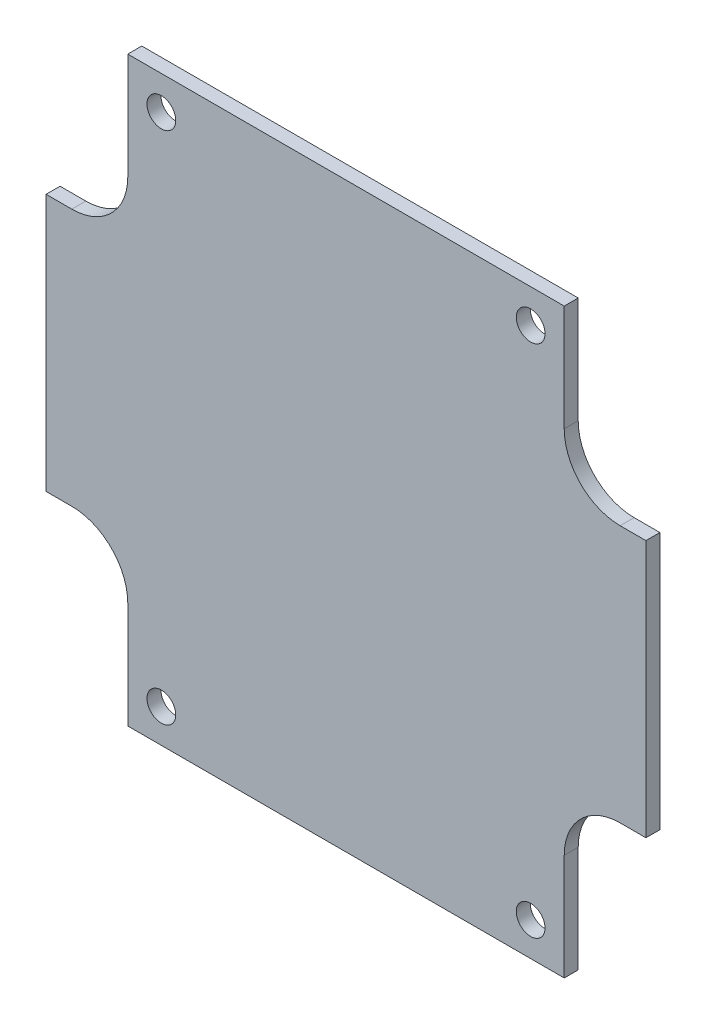
ISO-10303-21;
HEADER;
FILE_DESCRIPTION(('STEP AP214'),'2;1');
FILE_NAME('part.step','',(''),(''),'','','');
FILE_SCHEMA(('AUTOMOTIVE_DESIGN { 1 0 10303 214 1 1 1 1 }'));
ENDSEC;
DATA;
#1=APPLICATION_CONTEXT('core data for automotive mechanical design processes');
#2=APPLICATION_PROTOCOL_DEFINITION('international standard','automotive_design',2000,#1);
#3=PRODUCT_CONTEXT('',#1,'mechanical');
#4=PRODUCT('Part','Part','',(#3));
#5=PRODUCT_RELATED_PRODUCT_CATEGORY('part','',(#4));
#6=PRODUCT_DEFINITION_FORMATION('','',#4);
#7=PRODUCT_DEFINITION_CONTEXT('part definition',#1,'design');
#8=PRODUCT_DEFINITION('design','',#6,#7);
#9=PRODUCT_DEFINITION_SHAPE('','',#8);
#10=(LENGTH_UNIT() NAMED_UNIT(*) SI_UNIT(.MILLI.,.METRE.));
#11=(NAMED_UNIT(*) PLANE_ANGLE_UNIT() SI_UNIT($,.RADIAN.));
#12=(NAMED_UNIT(*) SI_UNIT($,.STERADIAN.) SOLID_ANGLE_UNIT());
#13=UNCERTAINTY_MEASURE_WITH_UNIT(LENGTH_MEASURE(1.E-05),#10,'distance_accuracy_value','');
#14=(GEOMETRIC_REPRESENTATION_CONTEXT(3) GLOBAL_UNCERTAINTY_ASSIGNED_CONTEXT((#13)) GLOBAL_UNIT_ASSIGNED_CONTEXT((#10,
#11,#12)) REPRESENTATION_CONTEXT('',''));
#15=CARTESIAN_POINT('',(0.,0.,0.));
#16=DIRECTION('',(0.,0.,1.));
#17=DIRECTION('',(1.,0.,0.));
#18=AXIS2_PLACEMENT_3D('',#15,#16,#17);
#19=CARTESIAN_POINT('',(0.,18.415,1.5875));
#20=DIRECTION('',(0.,1.,0.));
#21=DIRECTION('',(0.,0.,1.));
#22=AXIS2_PLACEMENT_3D('',#19,#20,#21);
#23=PLANE('',#22);
#24=DIRECTION('',(1.,0.,0.));
#25=VECTOR('',#24,1.);
#26=CARTESIAN_POINT('',(0.,18.415,0.));
#27=LINE('',#26,#25);
#28=CARTESIAN_POINT('',(0.,18.415,0.));
#29=VERTEX_POINT('',#28);
#30=CARTESIAN_POINT('',(2.92099999999996,18.415,0.));
#31=VERTEX_POINT('',#30);
#32=EDGE_CURVE('E176',#29,#31,#27,.T.);
#33=ORIENTED_EDGE('',*,*,#32,.T.);
#34=DIRECTION('',(0.,0.,-1.));
#35=VECTOR('',#34,1.);
#36=CARTESIAN_POINT('',(2.92099999999996,18.415,1.5875));
#37=LINE('',#36,#35);
#38=CARTESIAN_POINT('',(2.92099999999996,18.415,1.5875));
#39=VERTEX_POINT('',#38);
#40=EDGE_CURVE('E11',#39,#31,#37,.T.);
#41=ORIENTED_EDGE('',*,*,#40,.F.);
#42=DIRECTION('',(1.,0.,0.));
#43=VECTOR('',#42,1.);
#44=CARTESIAN_POINT('',(0.,18.415,1.5875));
#45=LINE('',#44,#43);
#46=CARTESIAN_POINT('',(0.,18.415,1.5875));
#47=VERTEX_POINT('',#46);
#48=EDGE_CURVE('E207',#47,#39,#45,.T.);
#49=ORIENTED_EDGE('',*,*,#48,.F.);
#50=DIRECTION('',(0.,0.,-1.));
#51=VECTOR('',#50,1.);
#52=CARTESIAN_POINT('',(0.,18.415,1.5875));
#53=LINE('',#52,#51);
#54=EDGE_CURVE('E172',#47,#29,#53,.T.);
#55=ORIENTED_EDGE('',*,*,#54,.T.);
#56=EDGE_LOOP('',(#33,#41,#49,#55));
#57=FACE_BOUND('',#56,.T.);
#58=ADVANCED_FACE('F32',(#57),#23,.F.);
#59=CARTESIAN_POINT('',(2.92100000000001,12.065,1.5875));
#60=DIRECTION('',(0.,0.,-1.));
#61=DIRECTION('',(-1.,0.,0.));
#62=AXIS2_PLACEMENT_3D('',#59,#60,#61);
#63=CYLINDRICAL_SURFACE('',#62,6.35);
#64=CARTESIAN_POINT('',(2.92100000000001,12.065,0.));
#65=DIRECTION('',(0.,0.,-1.));
#66=DIRECTION('',(-1.,0.,0.));
#67=AXIS2_PLACEMENT_3D('',#64,#65,#66);
#68=CIRCLE('',#67,6.35);
#69=CARTESIAN_POINT('',(9.27100000000001,12.065,0.));
#70=VERTEX_POINT('',#69);
#71=EDGE_CURVE('E179',#31,#70,#68,.T.);
#72=ORIENTED_EDGE('',*,*,#71,.T.);
#73=DIRECTION('',(0.,0.,-1.));
#74=VECTOR('',#73,1.);
#75=CARTESIAN_POINT('',(9.27100000000001,12.065,1.5875));
#76=LINE('',#75,#74);
#77=CARTESIAN_POINT('',(9.27100000000001,12.065,1.5875));
#78=VERTEX_POINT('',#77);
#79=EDGE_CURVE('E40',#78,#70,#76,.T.);
#80=ORIENTED_EDGE('',*,*,#79,.F.);
#81=CARTESIAN_POINT('',(2.92100000000001,12.065,1.5875));
#82=DIRECTION('',(0.,0.,-1.));
#83=DIRECTION('',(-1.,0.,0.));
#84=AXIS2_PLACEMENT_3D('',#81,#82,#83);
#85=CIRCLE('',#84,6.35);
#86=EDGE_CURVE('E115',#39,#78,#85,.T.);
#87=ORIENTED_EDGE('',*,*,#86,.F.);
#88=ORIENTED_EDGE('',*,*,#40,.T.);
#89=EDGE_LOOP('',(#72,#80,#87,#88));
#90=FACE_BOUND('',#89,.T.);
#91=ADVANCED_FACE('F307',(#90),#63,.F.);
#92=CARTESIAN_POINT('',(9.27100000000001,12.065,1.5875));
#93=DIRECTION('',(1.,0.,0.));
#94=DIRECTION('',(0.,1.,0.));
#95=AXIS2_PLACEMENT_3D('',#92,#93,#94);
#96=PLANE('',#95);
#97=DIRECTION('',(0.,-1.,0.));
#98=VECTOR('',#97,1.);
#99=CARTESIAN_POINT('',(9.27100000000001,12.065,0.));
#100=LINE('',#99,#98);
#101=CARTESIAN_POINT('',(9.27100000000001,0.,0.));
#102=VERTEX_POINT('',#101);
#103=EDGE_CURVE('E182',#70,#102,#100,.T.);
#104=ORIENTED_EDGE('',*,*,#103,.T.);
#105=DIRECTION('',(0.,0.,-1.));
#106=VECTOR('',#105,1.);
#107=CARTESIAN_POINT('',(9.27100000000001,0.,1.5875));
#108=LINE('',#107,#106);
#109=CARTESIAN_POINT('',(9.27100000000001,0.,1.5875));
#110=VERTEX_POINT('',#109);
#111=EDGE_CURVE('E238',#110,#102,#108,.T.);
#112=ORIENTED_EDGE('',*,*,#111,.F.);
#113=DIRECTION('',(0.,-1.,0.));
#114=VECTOR('',#113,1.);
#115=CARTESIAN_POINT('',(9.27100000000001,12.065,1.5875));
#116=LINE('',#115,#114);
#117=EDGE_CURVE('E246',#78,#110,#116,.T.);
#118=ORIENTED_EDGE('',*,*,#117,.F.);
#119=ORIENTED_EDGE('',*,*,#79,.T.);
#120=EDGE_LOOP('',(#104,#112,#118,#119));
#121=FACE_BOUND('',#120,.T.);
#122=ADVANCED_FACE('F244',(#121),#96,.F.);
#123=CARTESIAN_POINT('',(9.27100000000001,0.,1.5875));
#124=DIRECTION('',(0.,1.,0.));
#125=DIRECTION('',(-1.,0.,0.));
#126=AXIS2_PLACEMENT_3D('',#123,#124,#125);
#127=PLANE('',#126);
#128=DIRECTION('',(1.,0.,0.));
#129=VECTOR('',#128,1.);
#130=CARTESIAN_POINT('',(9.27100000000001,0.,0.));
#131=LINE('',#130,#129);
#132=CARTESIAN_POINT('',(58.801,0.,0.));
#133=VERTEX_POINT('',#132);
#134=EDGE_CURVE('E184',#102,#133,#131,.T.);
#135=ORIENTED_EDGE('',*,*,#134,.T.);
#136=DIRECTION('',(0.,0.,-1.));
#137=VECTOR('',#136,1.);
#138=CARTESIAN_POINT('',(58.801,0.,1.5875));
#139=LINE('',#138,#137);
#140=CARTESIAN_POINT('',(58.801,0.,1.5875));
#141=VERTEX_POINT('',#140);
#142=EDGE_CURVE('E235',#141,#133,#139,.T.);
#143=ORIENTED_EDGE('',*,*,#142,.F.);
#144=DIRECTION('',(1.,0.,0.));
#145=VECTOR('',#144,1.);
#146=CARTESIAN_POINT('',(9.27100000000001,0.,1.5875));
#147=LINE('',#146,#145);
#148=EDGE_CURVE('E264',#110,#141,#147,.T.);
#149=ORIENTED_EDGE('',*,*,#148,.F.);
#150=ORIENTED_EDGE('',*,*,#111,.T.);
#151=EDGE_LOOP('',(#135,#143,#149,#150));
#152=FACE_BOUND('',#151,.T.);
#153=ADVANCED_FACE('F255',(#152),#127,.F.);
#154=CARTESIAN_POINT('',(58.801,12.065,1.5875));
#155=DIRECTION('',(-1.,0.,0.));
#156=DIRECTION('',(0.,0.,1.));
#157=AXIS2_PLACEMENT_3D('',#154,#155,#156);
#158=PLANE('',#157);
#159=DIRECTION('',(0.,1.,0.));
#160=VECTOR('',#159,1.);
#161=CARTESIAN_POINT('',(58.801,12.065,0.));
#162=LINE('',#161,#160);
#163=CARTESIAN_POINT('',(58.801,12.065,0.));
#164=VERTEX_POINT('',#163);
#165=EDGE_CURVE('E186',#133,#164,#162,.T.);
#166=ORIENTED_EDGE('',*,*,#165,.T.);
#167=DIRECTION('',(0.,0.,-1.));
#168=VECTOR('',#167,1.);
#169=CARTESIAN_POINT('',(58.801,12.065,1.5875));
#170=LINE('',#169,#168);
#171=CARTESIAN_POINT('',(58.801,12.065,1.5875));
#172=VERTEX_POINT('',#171);
#173=EDGE_CURVE('E232',#172,#164,#170,.T.);
#174=ORIENTED_EDGE('',*,*,#173,.F.);
#175=DIRECTION('',(0.,1.,0.));
#176=VECTOR('',#175,1.);
#177=CARTESIAN_POINT('',(58.801,12.065,1.5875));
#178=LINE('',#177,#176);
#179=EDGE_CURVE('E261',#141,#172,#178,.T.);
#180=ORIENTED_EDGE('',*,*,#179,.F.);
#181=ORIENTED_EDGE('',*,*,#142,.T.);
#182=EDGE_LOOP('',(#166,#174,#180,#181));
#183=FACE_BOUND('',#182,.T.);
#184=ADVANCED_FACE('F259',(#183),#158,.F.);
#185=CARTESIAN_POINT('',(65.151,12.065,1.5875));
#186=DIRECTION('',(0.,0.,-1.));
#187=DIRECTION('',(-1.,0.,0.));
#188=AXIS2_PLACEMENT_3D('',#185,#186,#187);
#189=CYLINDRICAL_SURFACE('',#188,6.35);
#190=CARTESIAN_POINT('',(65.151,12.065,0.));
#191=DIRECTION('',(0.,0.,-1.));
#192=DIRECTION('',(1.,0.,0.));
#193=AXIS2_PLACEMENT_3D('',#190,#191,#192);
#194=CIRCLE('',#193,6.35);
#195=CARTESIAN_POINT('',(65.151,18.415,0.));
#196=VERTEX_POINT('',#195);
#197=EDGE_CURVE('E188',#164,#196,#194,.T.);
#198=ORIENTED_EDGE('',*,*,#197,.T.);
#199=DIRECTION('',(0.,0.,-1.));
#200=VECTOR('',#199,1.);
#201=CARTESIAN_POINT('',(65.151,18.415,1.5875));
#202=LINE('',#201,#200);
#203=CARTESIAN_POINT('',(65.151,18.415,1.5875));
#204=VERTEX_POINT('',#203);
#205=EDGE_CURVE('E229',#204,#196,#202,.T.);
#206=ORIENTED_EDGE('',*,*,#205,.F.);
#207=CARTESIAN_POINT('',(65.151,12.065,1.5875));
#208=DIRECTION('',(0.,0.,-1.));
#209=DIRECTION('',(1.,0.,0.));
#210=AXIS2_PLACEMENT_3D('',#207,#208,#209);
#211=CIRCLE('',#210,6.35);
#212=EDGE_CURVE('E263',#172,#204,#211,.T.);
#213=ORIENTED_EDGE('',*,*,#212,.F.);
#214=ORIENTED_EDGE('',*,*,#173,.T.);
#215=EDGE_LOOP('',(#198,#206,#213,#214));
#216=FACE_BOUND('',#215,.T.);
#217=ADVANCED_FACE('F320',(#216),#189,.F.);
#218=CARTESIAN_POINT('',(68.072,18.415,1.5875));
#219=DIRECTION('',(0.,1.,0.));
#220=DIRECTION('',(0.,0.,1.));
#221=AXIS2_PLACEMENT_3D('',#218,#219,#220);
#222=PLANE('',#221);
#223=DIRECTION('',(1.,0.,0.));
#224=VECTOR('',#223,1.);
#225=CARTESIAN_POINT('',(68.072,18.415,0.));
#226=LINE('',#225,#224);
#227=CARTESIAN_POINT('',(68.072,18.415,0.));
#228=VERTEX_POINT('',#227);
#229=EDGE_CURVE('E190',#196,#228,#226,.T.);
#230=ORIENTED_EDGE('',*,*,#229,.T.);
#231=DIRECTION('',(0.,0.,-1.));
#232=VECTOR('',#231,1.);
#233=CARTESIAN_POINT('',(68.072,18.415,1.5875));
#234=LINE('',#233,#232);
#235=CARTESIAN_POINT('',(68.072,18.415,1.5875));
#236=VERTEX_POINT('',#235);
#237=EDGE_CURVE('E226',#236,#228,#234,.T.);
#238=ORIENTED_EDGE('',*,*,#237,.F.);
#239=DIRECTION('',(1.,0.,0.));
#240=VECTOR('',#239,1.);
#241=CARTESIAN_POINT('',(68.072,18.415,1.5875));
#242=LINE('',#241,#240);
#243=EDGE_CURVE('E266',#204,#236,#242,.T.);
#244=ORIENTED_EDGE('',*,*,#243,.F.);
#245=ORIENTED_EDGE('',*,*,#205,.T.);
#246=EDGE_LOOP('',(#230,#238,#244,#245));
#247=FACE_BOUND('',#246,.T.);
#248=ADVANCED_FACE('F323',(#247),#222,.F.);
#249=CARTESIAN_POINT('',(68.072,47.625,1.5875));
#250=DIRECTION('',(-1.,0.,0.));
#251=DIRECTION('',(0.,0.,1.));
#252=AXIS2_PLACEMENT_3D('',#249,#250,#251);
#253=PLANE('',#252);
#254=DIRECTION('',(0.,1.,0.));
#255=VECTOR('',#254,1.);
#256=CARTESIAN_POINT('',(68.072,47.625,0.));
#257=LINE('',#256,#255);
#258=CARTESIAN_POINT('',(68.072,47.625,0.));
#259=VERTEX_POINT('',#258);
#260=EDGE_CURVE('E192',#228,#259,#257,.T.);
#261=ORIENTED_EDGE('',*,*,#260,.T.);
#262=DIRECTION('',(0.,0.,-1.));
#263=VECTOR('',#262,1.);
#264=CARTESIAN_POINT('',(68.072,47.625,1.5875));
#265=LINE('',#264,#263);
#266=CARTESIAN_POINT('',(68.072,47.625,1.5875));
#267=VERTEX_POINT('',#266);
#268=EDGE_CURVE('E223',#267,#259,#265,.T.);
#269=ORIENTED_EDGE('',*,*,#268,.F.);
#270=DIRECTION('',(0.,1.,0.));
#271=VECTOR('',#270,1.);
#272=CARTESIAN_POINT('',(68.072,47.625,1.5875));
#273=LINE('',#272,#271);
#274=EDGE_CURVE('E272',#236,#267,#273,.T.);
#275=ORIENTED_EDGE('',*,*,#274,.F.);
#276=ORIENTED_EDGE('',*,*,#237,.T.);
#277=EDGE_LOOP('',(#261,#269,#275,#276));
#278=FACE_BOUND('',#277,.T.);
#279=ADVANCED_FACE('F327',(#278),#253,.F.);
#280=CARTESIAN_POINT('',(68.072,47.625,1.5875));
#281=DIRECTION('',(0.,-1.,0.));
#282=DIRECTION('',(0.,0.,-1.));
#283=AXIS2_PLACEMENT_3D('',#280,#281,#282);
#284=PLANE('',#283);
#285=DIRECTION('',(-1.,0.,0.));
#286=VECTOR('',#285,1.);
#287=CARTESIAN_POINT('',(68.072,47.625,0.));
#288=LINE('',#287,#286);
#289=CARTESIAN_POINT('',(65.151,47.625,0.));
#290=VERTEX_POINT('',#289);
#291=EDGE_CURVE('E194',#259,#290,#288,.T.);
#292=ORIENTED_EDGE('',*,*,#291,.T.);
#293=DIRECTION('',(0.,0.,-1.));
#294=VECTOR('',#293,1.);
#295=CARTESIAN_POINT('',(65.151,47.625,1.5875));
#296=LINE('',#295,#294);
#297=CARTESIAN_POINT('',(65.151,47.625,1.5875));
#298=VERTEX_POINT('',#297);
#299=EDGE_CURVE('E220',#298,#290,#296,.T.);
#300=ORIENTED_EDGE('',*,*,#299,.F.);
#301=DIRECTION('',(-1.,0.,0.));
#302=VECTOR('',#301,1.);
#303=CARTESIAN_POINT('',(68.072,47.625,1.5875));
#304=LINE('',#303,#302);
#305=EDGE_CURVE('E274',#267,#298,#304,.T.);
#306=ORIENTED_EDGE('',*,*,#305,.F.);
#307=ORIENTED_EDGE('',*,*,#268,.T.);
#308=EDGE_LOOP('',(#292,#300,#306,#307));
#309=FACE_BOUND('',#308,.T.);
#310=ADVANCED_FACE('F331',(#309),#284,.F.);
#311=CARTESIAN_POINT('',(65.151,53.975,1.5875));
#312=DIRECTION('',(0.,0.,-1.));
#313=DIRECTION('',(-1.,0.,0.));
#314=AXIS2_PLACEMENT_3D('',#311,#312,#313);
#315=CYLINDRICAL_SURFACE('',#314,6.35);
#316=CARTESIAN_POINT('',(65.151,53.975,0.));
#317=DIRECTION('',(0.,0.,-1.));
#318=DIRECTION('',(1.,0.,0.));
#319=AXIS2_PLACEMENT_3D('',#316,#317,#318);
#320=CIRCLE('',#319,6.35);
#321=CARTESIAN_POINT('',(58.801,53.975,0.));
#322=VERTEX_POINT('',#321);
#323=EDGE_CURVE('E196',#290,#322,#320,.T.);
#324=ORIENTED_EDGE('',*,*,#323,.T.);
#325=DIRECTION('',(0.,0.,-1.));
#326=VECTOR('',#325,1.);
#327=CARTESIAN_POINT('',(58.801,53.975,1.5875));
#328=LINE('',#327,#326);
#329=CARTESIAN_POINT('',(58.801,53.975,1.5875));
#330=VERTEX_POINT('',#329);
#331=EDGE_CURVE('E217',#330,#322,#328,.T.);
#332=ORIENTED_EDGE('',*,*,#331,.F.);
#333=CARTESIAN_POINT('',(65.151,53.975,1.5875));
#334=DIRECTION('',(0.,0.,-1.));
#335=DIRECTION('',(1.,0.,0.));
#336=AXIS2_PLACEMENT_3D('',#333,#334,#335);
#337=CIRCLE('',#336,6.35);
#338=EDGE_CURVE('E276',#298,#330,#337,.T.);
#339=ORIENTED_EDGE('',*,*,#338,.F.);
#340=ORIENTED_EDGE('',*,*,#299,.T.);
#341=EDGE_LOOP('',(#324,#332,#339,#340));
#342=FACE_BOUND('',#341,.T.);
#343=ADVANCED_FACE('F335',(#342),#315,.F.);
#344=CARTESIAN_POINT('',(58.801,53.975,1.5875));
#345=DIRECTION('',(-1.,0.,0.));
#346=DIRECTION('',(0.,0.,1.));
#347=AXIS2_PLACEMENT_3D('',#344,#345,#346);
#348=PLANE('',#347);
#349=DIRECTION('',(0.,1.,0.));
#350=VECTOR('',#349,1.);
#351=CARTESIAN_POINT('',(58.801,53.975,0.));
#352=LINE('',#351,#350);
#353=CARTESIAN_POINT('',(58.801,66.04,0.));
#354=VERTEX_POINT('',#353);
#355=EDGE_CURVE('E198',#322,#354,#352,.T.);
#356=ORIENTED_EDGE('',*,*,#355,.T.);
#357=DIRECTION('',(0.,0.,-1.));
#358=VECTOR('',#357,1.);
#359=CARTESIAN_POINT('',(58.801,66.04,1.5875));
#360=LINE('',#359,#358);
#361=CARTESIAN_POINT('',(58.801,66.04,1.5875));
#362=VERTEX_POINT('',#361);
#363=EDGE_CURVE('E214',#362,#354,#360,.T.);
#364=ORIENTED_EDGE('',*,*,#363,.F.);
#365=DIRECTION('',(0.,1.,0.));
#366=VECTOR('',#365,1.);
#367=CARTESIAN_POINT('',(58.801,53.975,1.5875));
#368=LINE('',#367,#366);
#369=EDGE_CURVE('E278',#330,#362,#368,.T.);
#370=ORIENTED_EDGE('',*,*,#369,.F.);
#371=ORIENTED_EDGE('',*,*,#331,.T.);
#372=EDGE_LOOP('',(#356,#364,#370,#371));
#373=FACE_BOUND('',#372,.T.);
#374=ADVANCED_FACE('F339',(#373),#348,.F.);
#375=CARTESIAN_POINT('',(9.27099999999999,66.04,1.5875));
#376=DIRECTION('',(0.,-1.,0.));
#377=DIRECTION('',(0.,0.,-1.));
#378=AXIS2_PLACEMENT_3D('',#375,#376,#377);
#379=PLANE('',#378);
#380=DIRECTION('',(-1.,0.,0.));
#381=VECTOR('',#380,1.);
#382=CARTESIAN_POINT('',(9.27099999999999,66.04,0.));
#383=LINE('',#382,#381);
#384=CARTESIAN_POINT('',(9.27099999999999,66.04,0.));
#385=VERTEX_POINT('',#384);
#386=EDGE_CURVE('E200',#354,#385,#383,.T.);
#387=ORIENTED_EDGE('',*,*,#386,.T.);
#388=DIRECTION('',(0.,0.,-1.));
#389=VECTOR('',#388,1.);
#390=CARTESIAN_POINT('',(9.27099999999999,66.04,1.5875));
#391=LINE('',#390,#389);
#392=CARTESIAN_POINT('',(9.27099999999999,66.04,1.5875));
#393=VERTEX_POINT('',#392);
#394=EDGE_CURVE('E211',#393,#385,#391,.T.);
#395=ORIENTED_EDGE('',*,*,#394,.F.);
#396=DIRECTION('',(-1.,0.,0.));
#397=VECTOR('',#396,1.);
#398=CARTESIAN_POINT('',(9.27099999999999,66.04,1.5875));
#399=LINE('',#398,#397);
#400=EDGE_CURVE('E280',#362,#393,#399,.T.);
#401=ORIENTED_EDGE('',*,*,#400,.F.);
#402=ORIENTED_EDGE('',*,*,#363,.T.);
#403=EDGE_LOOP('',(#387,#395,#401,#402));
#404=FACE_BOUND('',#403,.T.);
#405=ADVANCED_FACE('F286',(#404),#379,.F.);
#406=CARTESIAN_POINT('',(9.27099999999999,53.975,1.5875));
#407=DIRECTION('',(1.,0.,0.));
#408=DIRECTION('',(0.,0.,-1.));
#409=AXIS2_PLACEMENT_3D('',#406,#407,#408);
#410=PLANE('',#409);
#411=DIRECTION('',(0.,-1.,0.));
#412=VECTOR('',#411,1.);
#413=CARTESIAN_POINT('',(9.27099999999999,53.975,0.));
#414=LINE('',#413,#412);
#415=CARTESIAN_POINT('',(9.27099999999999,53.975,0.));
#416=VERTEX_POINT('',#415);
#417=EDGE_CURVE('E202',#385,#416,#414,.T.);
#418=ORIENTED_EDGE('',*,*,#417,.T.);
#419=DIRECTION('',(0.,0.,-1.));
#420=VECTOR('',#419,1.);
#421=CARTESIAN_POINT('',(9.27099999999999,53.975,1.5875));
#422=LINE('',#421,#420);
#423=CARTESIAN_POINT('',(9.27099999999999,53.975,1.5875));
#424=VERTEX_POINT('',#423);
#425=EDGE_CURVE('E167',#424,#416,#422,.T.);
#426=ORIENTED_EDGE('',*,*,#425,.F.);
#427=DIRECTION('',(0.,-1.,0.));
#428=VECTOR('',#427,1.);
#429=CARTESIAN_POINT('',(9.27099999999999,53.975,1.5875));
#430=LINE('',#429,#428);
#431=EDGE_CURVE('E158',#393,#424,#430,.T.);
#432=ORIENTED_EDGE('',*,*,#431,.F.);
#433=ORIENTED_EDGE('',*,*,#394,.T.);
#434=EDGE_LOOP('',(#418,#426,#432,#433));
#435=FACE_BOUND('',#434,.T.);
#436=ADVANCED_FACE('F290',(#435),#410,.F.);
#437=CARTESIAN_POINT('',(2.92099999999999,53.975,1.5875));
#438=DIRECTION('',(0.,0.,-1.));
#439=DIRECTION('',(-1.,0.,0.));
#440=AXIS2_PLACEMENT_3D('',#437,#438,#439);
#441=CYLINDRICAL_SURFACE('',#440,6.35);
#442=CARTESIAN_POINT('',(2.92099999999999,53.975,0.));
#443=DIRECTION('',(0.,0.,-1.));
#444=DIRECTION('',(-1.,0.,0.));
#445=AXIS2_PLACEMENT_3D('',#442,#443,#444);
#446=CIRCLE('',#445,6.35);
#447=CARTESIAN_POINT('',(2.92099999999995,47.625,0.));
#448=VERTEX_POINT('',#447);
#449=EDGE_CURVE('E166',#416,#448,#446,.T.);
#450=ORIENTED_EDGE('',*,*,#449,.T.);
#451=DIRECTION('',(0.,0.,-1.));
#452=VECTOR('',#451,1.);
#453=CARTESIAN_POINT('',(2.92099999999995,47.625,1.5875));
#454=LINE('',#453,#452);
#455=CARTESIAN_POINT('',(2.92099999999995,47.625,1.5875));
#456=VERTEX_POINT('',#455);
#457=EDGE_CURVE('E163',#456,#448,#454,.T.);
#458=ORIENTED_EDGE('',*,*,#457,.F.);
#459=CARTESIAN_POINT('',(2.92099999999999,53.975,1.5875));
#460=DIRECTION('',(0.,0.,-1.));
#461=DIRECTION('',(-1.,0.,0.));
#462=AXIS2_PLACEMENT_3D('',#459,#460,#461);
#463=CIRCLE('',#462,6.35);
#464=EDGE_CURVE('E152',#424,#456,#463,.T.);
#465=ORIENTED_EDGE('',*,*,#464,.F.);
#466=ORIENTED_EDGE('',*,*,#425,.T.);
#467=EDGE_LOOP('',(#450,#458,#465,#466));
#468=FACE_BOUND('',#467,.T.);
#469=ADVANCED_FACE('F164',(#468),#441,.F.);
#470=CARTESIAN_POINT('',(0.,47.625,1.5875));
#471=DIRECTION('',(0.,-1.,0.));
#472=DIRECTION('',(0.,0.,-1.));
#473=AXIS2_PLACEMENT_3D('',#470,#471,#472);
#474=PLANE('',#473);
#475=DIRECTION('',(-1.,0.,0.));
#476=VECTOR('',#475,1.);
#477=CARTESIAN_POINT('',(0.,47.625,0.));
#478=LINE('',#477,#476);
#479=CARTESIAN_POINT('',(0.,47.625,0.));
#480=VERTEX_POINT('',#479);
#481=EDGE_CURVE('E101',#448,#480,#478,.T.);
#482=ORIENTED_EDGE('',*,*,#481,.T.);
#483=DIRECTION('',(0.,0.,-1.));
#484=VECTOR('',#483,1.);
#485=CARTESIAN_POINT('',(0.,47.625,1.5875));
#486=LINE('',#485,#484);
#487=CARTESIAN_POINT('',(0.,47.625,1.5875));
#488=VERTEX_POINT('',#487);
#489=EDGE_CURVE('E168',#488,#480,#486,.T.);
#490=ORIENTED_EDGE('',*,*,#489,.F.);
#491=DIRECTION('',(-1.,0.,0.));
#492=VECTOR('',#491,1.);
#493=CARTESIAN_POINT('',(0.,47.625,1.5875));
#494=LINE('',#493,#492);
#495=EDGE_CURVE('E156',#456,#488,#494,.T.);
#496=ORIENTED_EDGE('',*,*,#495,.F.);
#497=ORIENTED_EDGE('',*,*,#457,.T.);
#498=EDGE_LOOP('',(#482,#490,#496,#497));
#499=FACE_BOUND('',#498,.T.);
#500=ADVANCED_FACE('F170',(#499),#474,.F.);
#501=CARTESIAN_POINT('',(0.,47.625,1.5875));
#502=DIRECTION('',(1.,0.,0.));
#503=DIRECTION('',(0.,1.,0.));
#504=AXIS2_PLACEMENT_3D('',#501,#502,#503);
#505=PLANE('',#504);
#506=DIRECTION('',(0.,-1.,0.));
#507=VECTOR('',#506,1.);
#508=CARTESIAN_POINT('',(0.,47.625,0.));
#509=LINE('',#508,#507);
#510=EDGE_CURVE('E107',#480,#29,#509,.T.);
#511=ORIENTED_EDGE('',*,*,#510,.T.);
#512=ORIENTED_EDGE('',*,*,#54,.F.);
#513=DIRECTION('',(0.,-1.,0.));
#514=VECTOR('',#513,1.);
#515=CARTESIAN_POINT('',(0.,47.625,1.5875));
#516=LINE('',#515,#514);
#517=EDGE_CURVE('E48',#488,#47,#516,.T.);
#518=ORIENTED_EDGE('',*,*,#517,.F.);
#519=ORIENTED_EDGE('',*,*,#489,.T.);
#520=EDGE_LOOP('',(#511,#512,#518,#519));
#521=FACE_BOUND('',#520,.T.);
#522=ADVANCED_FACE('F294',(#521),#505,.F.);
#523=CARTESIAN_POINT('',(2.92100000000001,12.065,1.5875));
#524=DIRECTION('',(0.,0.,-1.));
#525=DIRECTION('',(-1.,0.,0.));
#526=AXIS2_PLACEMENT_3D('',#523,#524,#525);
#527=PLANE('',#526);
#528=CARTESIAN_POINT('',(13.081,62.23,1.5875));
#529=DIRECTION('',(0.,0.,1.));
#530=DIRECTION('',(1.,0.,0.));
#531=AXIS2_PLACEMENT_3D('',#528,#529,#530);
#532=CIRCLE('',#531,1.63195);
#533=CARTESIAN_POINT('',(14.71295,62.23,1.5875));
#534=VERTEX_POINT('',#533);
#535=EDGE_CURVE('E420',#534,#534,#532,.T.);
#536=ORIENTED_EDGE('',*,*,#535,.F.);
#537=EDGE_LOOP('',(#536));
#538=FACE_BOUND('',#537,.T.);
#539=CARTESIAN_POINT('',(13.081,3.80999999999999,1.5875));
#540=DIRECTION('',(0.,0.,1.));
#541=DIRECTION('',(1.,0.,0.));
#542=AXIS2_PLACEMENT_3D('',#539,#540,#541);
#543=CIRCLE('',#542,1.63195);
#544=CARTESIAN_POINT('',(14.71295,3.80999999999999,1.5875));
#545=VERTEX_POINT('',#544);
#546=EDGE_CURVE('E422',#545,#545,#543,.F.);
#547=ORIENTED_EDGE('',*,*,#546,.T.);
#548=EDGE_LOOP('',(#547));
#549=FACE_BOUND('',#548,.T.);
#550=CARTESIAN_POINT('',(54.991,3.81000000000004,1.5875));
#551=DIRECTION('',(0.,0.,1.));
#552=DIRECTION('',(1.,0.,0.));
#553=AXIS2_PLACEMENT_3D('',#550,#551,#552);
#554=CIRCLE('',#553,1.63195);
#555=CARTESIAN_POINT('',(56.62295,3.81000000000004,1.5875));
#556=VERTEX_POINT('',#555);
#557=EDGE_CURVE('E428',#556,#556,#554,.T.);
#558=ORIENTED_EDGE('',*,*,#557,.F.);
#559=EDGE_LOOP('',(#558));
#560=FACE_BOUND('',#559,.T.);
#561=CARTESIAN_POINT('',(54.991,62.23,1.5875));
#562=DIRECTION('',(0.,0.,1.));
#563=DIRECTION('',(1.,0.,0.));
#564=AXIS2_PLACEMENT_3D('',#561,#562,#563);
#565=CIRCLE('',#564,1.63195);
#566=CARTESIAN_POINT('',(56.62295,62.23,1.5875));
#567=VERTEX_POINT('',#566);
#568=EDGE_CURVE('E434',#567,#567,#565,.F.);
#569=ORIENTED_EDGE('',*,*,#568,.T.);
#570=EDGE_LOOP('',(#569));
#571=FACE_BOUND('',#570,.T.);
#572=ORIENTED_EDGE('',*,*,#48,.T.);
#573=ORIENTED_EDGE('',*,*,#86,.T.);
#574=ORIENTED_EDGE('',*,*,#117,.T.);
#575=ORIENTED_EDGE('',*,*,#148,.T.);
#576=ORIENTED_EDGE('',*,*,#179,.T.);
#577=ORIENTED_EDGE('',*,*,#212,.T.);
#578=ORIENTED_EDGE('',*,*,#243,.T.);
#579=ORIENTED_EDGE('',*,*,#274,.T.);
#580=ORIENTED_EDGE('',*,*,#305,.T.);
#581=ORIENTED_EDGE('',*,*,#338,.T.);
#582=ORIENTED_EDGE('',*,*,#369,.T.);
#583=ORIENTED_EDGE('',*,*,#400,.T.);
#584=ORIENTED_EDGE('',*,*,#431,.T.);
#585=ORIENTED_EDGE('',*,*,#464,.T.);
#586=ORIENTED_EDGE('',*,*,#495,.T.);
#587=ORIENTED_EDGE('',*,*,#517,.T.);
#588=EDGE_LOOP('',(#572,#573,#574,#575,#576,#577,#578,#579,#580,#581,#582,#583,#584,#585,#586,#587));
#589=FACE_BOUND('',#588,.T.);
#590=ADVANCED_FACE('F154',(#538,#549,#560,#571,#589),#527,.F.);
#591=CARTESIAN_POINT('',(2.92100000000001,12.065,0.));
#592=DIRECTION('',(0.,0.,-1.));
#593=DIRECTION('',(-1.,0.,0.));
#594=AXIS2_PLACEMENT_3D('',#591,#592,#593);
#595=PLANE('',#594);
#596=CARTESIAN_POINT('',(13.081,62.23,0.));
#597=DIRECTION('',(0.,0.,1.));
#598=DIRECTION('',(1.,0.,0.));
#599=AXIS2_PLACEMENT_3D('',#596,#597,#598);
#600=CIRCLE('',#599,1.63195);
#601=CARTESIAN_POINT('',(14.71295,62.23,0.));
#602=VERTEX_POINT('',#601);
#603=EDGE_CURVE('E417',#602,#602,#600,.T.);
#604=ORIENTED_EDGE('',*,*,#603,.T.);
#605=EDGE_LOOP('',(#604));
#606=FACE_BOUND('',#605,.T.);
#607=CARTESIAN_POINT('',(13.081,3.80999999999999,0.));
#608=DIRECTION('',(0.,0.,1.));
#609=DIRECTION('',(1.,0.,0.));
#610=AXIS2_PLACEMENT_3D('',#607,#608,#609);
#611=CIRCLE('',#610,1.63195);
#612=CARTESIAN_POINT('',(14.71295,3.80999999999999,0.));
#613=VERTEX_POINT('',#612);
#614=EDGE_CURVE('E425',#613,#613,#611,.F.);
#615=ORIENTED_EDGE('',*,*,#614,.F.);
#616=EDGE_LOOP('',(#615));
#617=FACE_BOUND('',#616,.T.);
#618=CARTESIAN_POINT('',(54.991,3.81000000000004,0.));
#619=DIRECTION('',(0.,0.,1.));
#620=DIRECTION('',(1.,0.,0.));
#621=AXIS2_PLACEMENT_3D('',#618,#619,#620);
#622=CIRCLE('',#621,1.63195);
#623=CARTESIAN_POINT('',(56.62295,3.81000000000004,0.));
#624=VERTEX_POINT('',#623);
#625=EDGE_CURVE('E431',#624,#624,#622,.T.);
#626=ORIENTED_EDGE('',*,*,#625,.T.);
#627=EDGE_LOOP('',(#626));
#628=FACE_BOUND('',#627,.T.);
#629=CARTESIAN_POINT('',(54.991,62.23,0.));
#630=DIRECTION('',(0.,0.,1.));
#631=DIRECTION('',(1.,0.,0.));
#632=AXIS2_PLACEMENT_3D('',#629,#630,#631);
#633=CIRCLE('',#632,1.63195);
#634=CARTESIAN_POINT('',(56.62295,62.23,0.));
#635=VERTEX_POINT('',#634);
#636=EDGE_CURVE('E180',#635,#635,#633,.F.);
#637=ORIENTED_EDGE('',*,*,#636,.F.);
#638=EDGE_LOOP('',(#637));
#639=FACE_BOUND('',#638,.T.);
#640=ORIENTED_EDGE('',*,*,#32,.F.);
#641=ORIENTED_EDGE('',*,*,#510,.F.);
#642=ORIENTED_EDGE('',*,*,#481,.F.);
#643=ORIENTED_EDGE('',*,*,#449,.F.);
#644=ORIENTED_EDGE('',*,*,#417,.F.);
#645=ORIENTED_EDGE('',*,*,#386,.F.);
#646=ORIENTED_EDGE('',*,*,#355,.F.);
#647=ORIENTED_EDGE('',*,*,#323,.F.);
#648=ORIENTED_EDGE('',*,*,#291,.F.);
#649=ORIENTED_EDGE('',*,*,#260,.F.);
#650=ORIENTED_EDGE('',*,*,#229,.F.);
#651=ORIENTED_EDGE('',*,*,#197,.F.);
#652=ORIENTED_EDGE('',*,*,#165,.F.);
#653=ORIENTED_EDGE('',*,*,#134,.F.);
#654=ORIENTED_EDGE('',*,*,#103,.F.);
#655=ORIENTED_EDGE('',*,*,#71,.F.);
#656=EDGE_LOOP('',(#640,#641,#642,#643,#644,#645,#646,#647,#648,#649,#650,#651,#652,#653,#654,#655));
#657=FACE_BOUND('',#656,.T.);
#658=ADVANCED_FACE('F250',(#606,#617,#628,#639,#657),#595,.T.);
#659=CARTESIAN_POINT('',(54.991,62.23,0.));
#660=DIRECTION('',(0.,0.,1.));
#661=DIRECTION('',(1.,0.,0.));
#662=AXIS2_PLACEMENT_3D('',#659,#660,#661);
#663=CYLINDRICAL_SURFACE('',#662,1.63195);
#664=ORIENTED_EDGE('',*,*,#636,.T.);
#665=EDGE_LOOP('',(#664));
#666=FACE_BOUND('',#665,.T.);
#667=ORIENTED_EDGE('',*,*,#568,.F.);
#668=EDGE_LOOP('',(#667));
#669=FACE_BOUND('',#668,.T.);
#670=ADVANCED_FACE('F372',(#666,#669),#663,.F.);
#671=CARTESIAN_POINT('',(54.991,3.81000000000004,0.));
#672=DIRECTION('',(0.,0.,1.));
#673=DIRECTION('',(1.,0.,0.));
#674=AXIS2_PLACEMENT_3D('',#671,#672,#673);
#675=CYLINDRICAL_SURFACE('',#674,1.63195);
#676=ORIENTED_EDGE('',*,*,#625,.F.);
#677=EDGE_LOOP('',(#676));
#678=FACE_BOUND('',#677,.T.);
#679=ORIENTED_EDGE('',*,*,#557,.T.);
#680=EDGE_LOOP('',(#679));
#681=FACE_BOUND('',#680,.T.);
#682=ADVANCED_FACE('F380',(#678,#681),#675,.F.);
#683=CARTESIAN_POINT('',(13.081,3.80999999999999,0.));
#684=DIRECTION('',(0.,0.,1.));
#685=DIRECTION('',(1.,0.,0.));
#686=AXIS2_PLACEMENT_3D('',#683,#684,#685);
#687=CYLINDRICAL_SURFACE('',#686,1.63195);
#688=ORIENTED_EDGE('',*,*,#614,.T.);
#689=EDGE_LOOP('',(#688));
#690=FACE_BOUND('',#689,.T.);
#691=ORIENTED_EDGE('',*,*,#546,.F.);
#692=EDGE_LOOP('',(#691));
#693=FACE_BOUND('',#692,.T.);
#694=ADVANCED_FACE('F390',(#690,#693),#687,.F.);
#695=CARTESIAN_POINT('',(13.081,62.23,0.));
#696=DIRECTION('',(0.,0.,1.));
#697=DIRECTION('',(1.,0.,0.));
#698=AXIS2_PLACEMENT_3D('',#695,#696,#697);
#699=CYLINDRICAL_SURFACE('',#698,1.63195);
#700=ORIENTED_EDGE('',*,*,#603,.F.);
#701=EDGE_LOOP('',(#700));
#702=FACE_BOUND('',#701,.T.);
#703=ORIENTED_EDGE('',*,*,#535,.T.);
#704=EDGE_LOOP('',(#703));
#705=FACE_BOUND('',#704,.T.);
#706=ADVANCED_FACE('F400',(#702,#705),#699,.F.);
#707=CLOSED_SHELL('',(#58,#91,#122,#153,#184,#217,#248,#279,#310,#343,#374,#405,#436,#469,#500,
#522,#590,#658,#670,#682,#694,#706));
#708=MANIFOLD_SOLID_BREP('B2',#707);
#709=ADVANCED_BREP_SHAPE_REPRESENTATION('',(#18,#708),#14);
#710=SHAPE_DEFINITION_REPRESENTATION(#9,#709);
ENDSEC;
END-ISO-10303-21;
